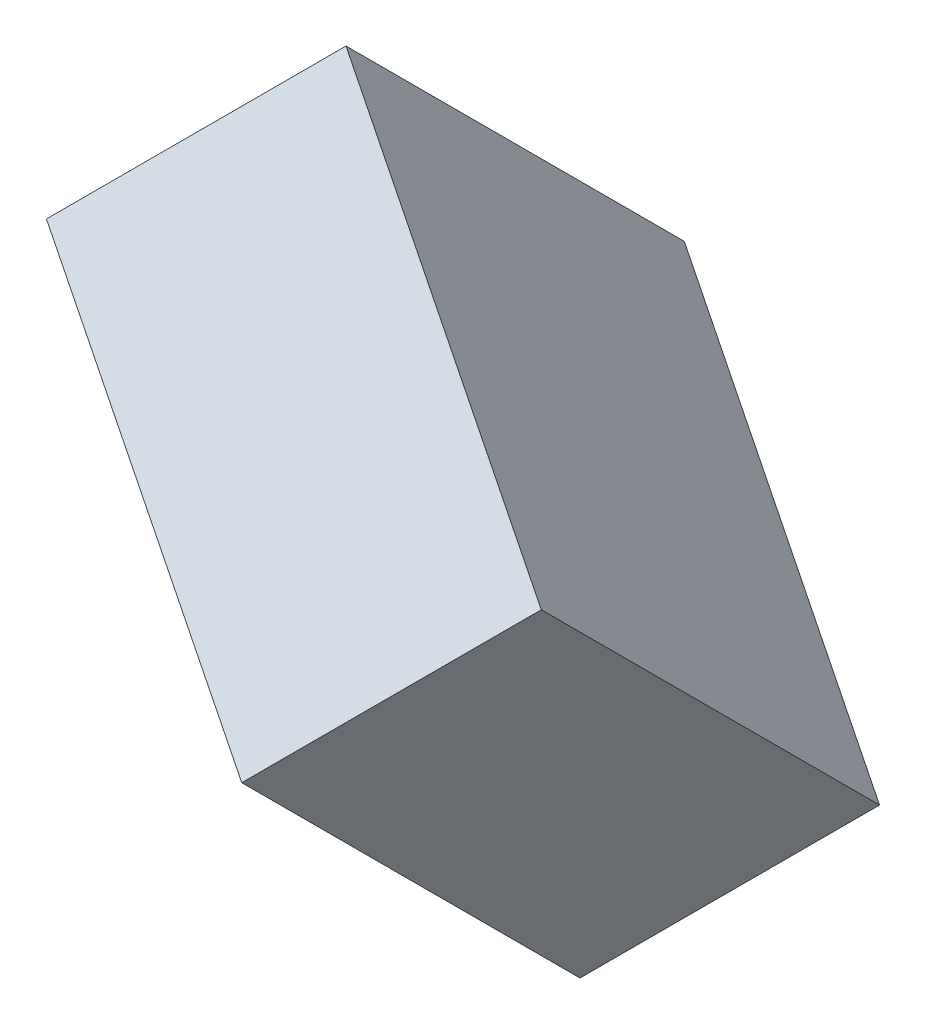
ISO-10303-21;
HEADER;
FILE_DESCRIPTION(('STEP AP214'),'2;1');
FILE_NAME('part.step','',(''),(''),'','','');
FILE_SCHEMA(('AUTOMOTIVE_DESIGN { 1 0 10303 214 1 1 1 1 }'));
ENDSEC;
DATA;
#1=APPLICATION_CONTEXT('core data for automotive mechanical design processes');
#2=APPLICATION_PROTOCOL_DEFINITION('international standard','automotive_design',2000,#1);
#3=PRODUCT_CONTEXT('',#1,'mechanical');
#4=PRODUCT('Part','Part','',(#3));
#5=PRODUCT_RELATED_PRODUCT_CATEGORY('part','',(#4));
#6=PRODUCT_DEFINITION_FORMATION('','',#4);
#7=PRODUCT_DEFINITION_CONTEXT('part definition',#1,'design');
#8=PRODUCT_DEFINITION('design','',#6,#7);
#9=PRODUCT_DEFINITION_SHAPE('','',#8);
#10=(LENGTH_UNIT() NAMED_UNIT(*) SI_UNIT(.MILLI.,.METRE.));
#11=(NAMED_UNIT(*) PLANE_ANGLE_UNIT() SI_UNIT($,.RADIAN.));
#12=(NAMED_UNIT(*) SI_UNIT($,.STERADIAN.) SOLID_ANGLE_UNIT());
#13=UNCERTAINTY_MEASURE_WITH_UNIT(LENGTH_MEASURE(1.E-05),#10,'distance_accuracy_value','');
#14=(GEOMETRIC_REPRESENTATION_CONTEXT(3) GLOBAL_UNCERTAINTY_ASSIGNED_CONTEXT((#13)) GLOBAL_UNIT_ASSIGNED_CONTEXT((#10,
#11,#12)) REPRESENTATION_CONTEXT('',''));
#15=CARTESIAN_POINT('',(0.,0.,0.));
#16=DIRECTION('',(0.,0.,1.));
#17=DIRECTION('',(1.,0.,0.));
#18=AXIS2_PLACEMENT_3D('',#15,#16,#17);
#19=CARTESIAN_POINT('',(24.9368585897261,24.9368596950449,-24.9368227024205));
#20=DIRECTION('',(-0.577350537619435,-0.577350563210324,0.577349706738708));
#21=DIRECTION('',(0.707106796857695,-0.7071067655154,0.));
#22=AXIS2_PLACEMENT_3D('',#19,#20,#21);
#23=PLANE('',#22);
#24=DIRECTION('',(0.408247883703273,0.408247901798737,0.816496978640294));
#25=VECTOR('',#24,1.);
#26=CARTESIAN_POINT('',(21.2615841130028,30.2542041789754,-23.2947500963727));
#27=LINE('',#26,#25);
#28=CARTESIAN_POINT('',(24.8615788817128,33.854199107254,-16.0947498781009));
#29=VERTEX_POINT('',#28);
#30=CARTESIAN_POINT('',(25.42825286087,34.4208731115289,-14.9614002385172));
#31=VERTEX_POINT('',#30);
#32=EDGE_CURVE('E218',#29,#31,#27,.T.);
#33=ORIENTED_EDGE('',*,*,#32,.F.);
#34=DIRECTION('',(0.,0.707106256706621,0.707107305666085));
#35=VECTOR('',#34,1.);
#36=CARTESIAN_POINT('',(24.8615788817128,24.9744996032201,-24.9744625547588));
#37=LINE('',#36,#35);
#38=CARTESIAN_POINT('',(24.8615788817128,23.0542396586723,-26.8947253479235));
#39=VERTEX_POINT('',#38);
#40=EDGE_CURVE('E379',#39,#29,#37,.T.);
#41=ORIENTED_EDGE('',*,*,#40,.F.);
#42=DIRECTION('',(0.707106796857695,-0.7071067655154,0.));
#43=VECTOR('',#42,1.);
#44=CARTESIAN_POINT('',(23.9579087192015,23.9579097811286,-26.8947253479235));
#45=LINE('',#44,#43);
#46=CARTESIAN_POINT('',(14.0616332907576,33.8541847709232,-26.8947253479235));
#47=VERTEX_POINT('',#46);
#48=EDGE_CURVE('E217',#47,#39,#45,.T.);
#49=ORIENTED_EDGE('',*,*,#48,.F.);
#50=DIRECTION('',(0.816496391119121,-0.408248783080944,0.408248177463634));
#51=VECTOR('',#50,1.);
#52=CARTESIAN_POINT('',(15.9282532593184,32.9208734434903,-25.9614154050128));
#53=LINE('',#52,#51);
#54=CARTESIAN_POINT('',(12.9282546522816,34.4208749029407,-27.4614146448014));
#55=VERTEX_POINT('',#54);
#56=EDGE_CURVE('E194',#55,#47,#53,.T.);
#57=ORIENTED_EDGE('',*,*,#56,.F.);
#58=CARTESIAN_POINT('',(11.5949210394075,37.0875412309669,-26.1280798926121));
#59=DIRECTION('',(-0.577350537619435,-0.577350563210324,0.577349706738708));
#60=DIRECTION('',(-0.707106526552883,0.707107035819914,5.40610115312701E-07));
#61=AXIS2_PLACEMENT_3D('',#58,#59,#60);
#62=ELLIPSE('',#61,4.,2.30940059257966);
#63=CARTESIAN_POINT('',(8.92825561256531,38.4208758632244,-27.4614125469322));
#64=VERTEX_POINT('',#63);
#65=EDGE_CURVE('E205',#64,#55,#62,.T.);
#66=ORIENTED_EDGE('',*,*,#65,.F.);
#67=DIRECTION('',(0.408248323946754,-0.816496373023439,-0.408248672789314));
#68=VECTOR('',#67,1.);
#69=CARTESIAN_POINT('',(4.76158807233364,46.7542081383065,-23.2947414463406));
#70=LINE('',#69,#68);
#71=CARTESIAN_POINT('',(8.36156889778253,39.5542489112447,-26.8947253479234));
#72=VERTEX_POINT('',#71);
#73=EDGE_CURVE('E202',#72,#64,#70,.T.);
#74=ORIENTED_EDGE('',*,*,#73,.F.);
#75=DIRECTION('',(0.707106796857694,-0.7071067655154,0.));
#76=VECTOR('',#75,1.);
#77=CARTESIAN_POINT('',(23.9579087192015,23.9579097811286,-26.8947253479235));
#78=LINE('',#77,#76);
#79=CARTESIAN_POINT('',(-2.43838183012104,50.3541991604437,-26.8947253479234));
#80=VERTEX_POINT('',#79);
#81=EDGE_CURVE('E715',#80,#72,#78,.T.);
#82=ORIENTED_EDGE('',*,*,#81,.F.);
#83=DIRECTION('',(-0.707106272377781,0.,-0.707107289994948));
#84=VECTOR('',#83,1.);
#85=CARTESIAN_POINT('',(12.2281700043155,50.3541991604437,-12.2281524064263));
#86=LINE('',#85,#84);
#87=CARTESIAN_POINT('',(8.36158124552423,50.3541991604437,-16.0947467297377));
#88=VERTEX_POINT('',#87);
#89=EDGE_CURVE('E705',#88,#80,#86,.T.);
#90=ORIENTED_EDGE('',*,*,#89,.F.);
#91=DIRECTION('',(-0.408247051382313,-0.408248734119096,-0.816496978639727));
#92=VECTOR('',#91,1.);
#93=CARTESIAN_POINT('',(8.92825261708387,50.9208728677428,-14.9613999947315));
#94=LINE('',#93,#92);
#95=CARTESIAN_POINT('',(8.92825261708386,50.9208728677428,-14.9613999947315));
#96=VERTEX_POINT('',#95);
#97=EDGE_CURVE('E234',#96,#88,#94,.T.);
#98=ORIENTED_EDGE('',*,*,#97,.F.);
#99=CARTESIAN_POINT('',(11.5949180439261,49.5875382354854,-13.6280673404114));
#100=DIRECTION('',(-0.577350537619435,-0.577350563210324,0.577349706738708));
#101=DIRECTION('',(0.70710627237778,0.,0.707107289994949));
#102=AXIS2_PLACEMENT_3D('',#99,#100,#101);
#103=ELLIPSE('',#102,4.,2.30940225284129);
#104=CARTESIAN_POINT('',(12.9282506982461,50.920870948905,-10.9613980758965));
#105=VERTEX_POINT('',#104);
#106=EDGE_CURVE('E231',#105,#96,#103,.T.);
#107=ORIENTED_EDGE('',*,*,#106,.F.);
#108=DIRECTION('',(-0.816496391119122,0.408248783080944,-0.408248177463634));
#109=VECTOR('',#108,1.);
#110=CARTESIAN_POINT('',(21.261580157128,46.7542002231004,-6.79473353114629));
#111=LINE('',#110,#109);
#112=CARTESIAN_POINT('',(14.0615926441446,50.3541991604437,-10.3947271280654));
#113=VERTEX_POINT('',#112);
#114=EDGE_CURVE('E228',#113,#105,#111,.T.);
#115=ORIENTED_EDGE('',*,*,#114,.F.);
#116=DIRECTION('',(-0.707106272377781,0.,-0.707107289994948));
#117=VECTOR('',#116,1.);
#118=CARTESIAN_POINT('',(12.2281700043155,50.3541991604437,-12.2281524064262));
#119=LINE('',#118,#117);
#120=CARTESIAN_POINT('',(24.8615788817128,50.3541991604437,0.40527465207656));
#121=VERTEX_POINT('',#120);
#122=EDGE_CURVE('E717',#121,#113,#119,.T.);
#123=ORIENTED_EDGE('',*,*,#122,.F.);
#124=DIRECTION('',(0.,0.707106256706622,0.707107305666085));
#125=VECTOR('',#124,1.);
#126=CARTESIAN_POINT('',(24.8615788817128,24.9744996032201,-24.9744625547588));
#127=LINE('',#126,#125);
#128=CARTESIAN_POINT('',(24.8615788817128,39.5542134547712,-10.3947270748758));
#129=VERTEX_POINT('',#128);
#130=EDGE_CURVE('E51',#129,#121,#127,.T.);
#131=ORIENTED_EDGE('',*,*,#130,.F.);
#132=DIRECTION('',(-0.408248792128709,0.816496373023617,0.408248204606864));
#133=VECTOR('',#132,1.);
#134=CARTESIAN_POINT('',(25.4282508829326,38.4208711335914,-10.9613982605827));
#135=LINE('',#134,#133);
#136=CARTESIAN_POINT('',(25.4282508829326,38.4208711335914,-10.9613982605827));
#137=VERTEX_POINT('',#136);
#138=EDGE_CURVE('E59',#137,#129,#135,.T.);
#139=ORIENTED_EDGE('',*,*,#138,.F.);
#140=CARTESIAN_POINT('',(24.0949182286125,37.0875384201718,-13.6280675250976));
#141=DIRECTION('',(-0.577350537619435,-0.577350563210324,0.577349706738708));
#142=DIRECTION('',(0.,-0.707106256706622,-0.707107305666084));
#143=AXIS2_PLACEMENT_3D('',#140,#141,#142);
#144=ELLIPSE('',#143,4.,2.30940215047774);
#145=EDGE_CURVE('E221',#31,#137,#144,.T.);
#146=ORIENTED_EDGE('',*,*,#145,.F.);
#147=EDGE_LOOP('',(#33,#41,#49,#57,#66,#74,#82,#90,#98,#107,#115,#123,#131,#139,#146));
#148=FACE_BOUND('',#147,.T.);
#149=DIRECTION('',(0.,0.707106256706622,0.707107305666085));
#150=VECTOR('',#149,1.);
#151=CARTESIAN_POINT('',(38.2152295107166,10.5819349829693,-26.0133786790841));
#152=LINE('',#151,#150);
#153=CARTESIAN_POINT('',(38.2152295107166,10.5819349829693,-26.0133786790841));
#154=VERTEX_POINT('',#153);
#155=CARTESIAN_POINT('',(38.2152295107166,49.4727791018334,12.8775231325506));
#156=VERTEX_POINT('',#155);
#157=EDGE_CURVE('E238',#154,#156,#152,.T.);
#158=ORIENTED_EDGE('',*,*,#157,.T.);
#159=DIRECTION('',(-0.816496391119122,0.408248783080944,-0.408248177463634));
#160=VECTOR('',#159,1.);
#161=CARTESIAN_POINT('',(38.2152295107166,49.4727791018334,12.8775231325506));
#162=LINE('',#161,#160);
#163=CARTESIAN_POINT('',(-6.69207200083505,71.9264621712853,-9.57612662794926));
#164=VERTEX_POINT('',#163);
#165=EDGE_CURVE('E750',#156,#164,#162,.T.);
#166=ORIENTED_EDGE('',*,*,#165,.T.);
#167=DIRECTION('',(0.,-0.707106256706621,-0.707107305666085));
#168=VECTOR('',#167,1.);
#169=CARTESIAN_POINT('',(-6.69207200083506,33.0356180524212,-48.4670284395839));
#170=LINE('',#169,#168);
#171=CARTESIAN_POINT('',(-6.69207200083506,33.0356180524212,-48.4670284395839));
#172=VERTEX_POINT('',#171);
#173=EDGE_CURVE('E748',#164,#172,#170,.T.);
#174=ORIENTED_EDGE('',*,*,#173,.T.);
#175=DIRECTION('',(0.816496391119122,-0.408248783080944,0.408248177463634));
#176=VECTOR('',#175,1.);
#177=CARTESIAN_POINT('',(38.2152295107166,10.5819349829693,-26.0133786790841));
#178=LINE('',#177,#176);
#179=EDGE_CURVE('E746',#172,#154,#178,.T.);
#180=ORIENTED_EDGE('',*,*,#179,.T.);
#181=EDGE_LOOP('',(#158,#166,#174,#180));
#182=FACE_BOUND('',#181,.T.);
#183=ADVANCED_FACE('F43',(#148,#182),#23,.T.);
#184=CARTESIAN_POINT('',(38.2152295107166,10.5819349829693,-26.0133786790841));
#185=DIRECTION('',(-0.816496391119122,0.408248783080944,-0.408248177463634));
#186=DIRECTION('',(-0.447214110377798,-0.89442693356081,0.));
#187=AXIS2_PLACEMENT_3D('',#184,#185,#186);
#188=PLANE('',#187);
#189=DIRECTION('',(0.,0.707106256706622,0.707107305666085));
#190=VECTOR('',#189,1.);
#191=CARTESIAN_POINT('',(55.4354188562685,27.8021250918008,-43.2335432425971));
#192=LINE('',#191,#190);
#193=CARTESIAN_POINT('',(55.4354188562685,27.8021250918008,-43.2335432425971));
#194=VERTEX_POINT('',#193);
#195=CARTESIAN_POINT('',(55.4354188562685,66.692969210665,-4.34264143096244));
#196=VERTEX_POINT('',#195);
#197=EDGE_CURVE('E740',#194,#196,#192,.T.);
#198=ORIENTED_EDGE('',*,*,#197,.T.);
#199=DIRECTION('',(0.577350537619435,0.577350563210324,-0.577349706738708));
#200=VECTOR('',#199,1.);
#201=CARTESIAN_POINT('',(38.2152295107166,49.4727791018334,12.8775231325506));
#202=LINE('',#201,#200);
#203=EDGE_CURVE('E726',#156,#196,#202,.T.);
#204=ORIENTED_EDGE('',*,*,#203,.F.);
#205=ORIENTED_EDGE('',*,*,#157,.F.);
#206=DIRECTION('',(0.577350537619435,0.577350563210324,-0.577349706738708));
#207=VECTOR('',#206,1.);
#208=CARTESIAN_POINT('',(38.2152295107166,10.5819349829693,-26.0133786790841));
#209=LINE('',#208,#207);
#210=EDGE_CURVE('E737',#154,#194,#209,.T.);
#211=ORIENTED_EDGE('',*,*,#210,.T.);
#212=EDGE_LOOP('',(#198,#204,#205,#211));
#213=FACE_BOUND('',#212,.T.);
#214=ADVANCED_FACE('F301',(#213),#188,.F.);
#215=CARTESIAN_POINT('',(38.2152295107166,49.4727791018334,12.8775231325506));
#216=DIRECTION('',(0.,-0.707106256706621,-0.707107305666085));
#217=DIRECTION('',(0.,0.707107305666085,-0.707106256706621));
#218=AXIS2_PLACEMENT_3D('',#215,#216,#217);
#219=PLANE('',#218);
#220=DIRECTION('',(-0.816496391119122,0.408248783080944,-0.408248177463634));
#221=VECTOR('',#220,1.);
#222=CARTESIAN_POINT('',(55.4354188562685,66.692969210665,-4.34264143096244));
#223=LINE('',#222,#221);
#224=CARTESIAN_POINT('',(10.5281173447168,89.1466522801169,-26.7962911914623));
#225=VERTEX_POINT('',#224);
#226=EDGE_CURVE('E730',#196,#225,#223,.T.);
#227=ORIENTED_EDGE('',*,*,#226,.T.);
#228=DIRECTION('',(0.577350537619435,0.577350563210324,-0.577349706738708));
#229=VECTOR('',#228,1.);
#230=CARTESIAN_POINT('',(-6.69207200083505,71.9264621712853,-9.57612662794926));
#231=LINE('',#230,#229);
#232=EDGE_CURVE('E731',#164,#225,#231,.T.);
#233=ORIENTED_EDGE('',*,*,#232,.F.);
#234=ORIENTED_EDGE('',*,*,#165,.F.);
#235=ORIENTED_EDGE('',*,*,#203,.T.);
#236=EDGE_LOOP('',(#227,#233,#234,#235));
#237=FACE_BOUND('',#236,.T.);
#238=ADVANCED_FACE('F304',(#237),#219,.F.);
#239=CARTESIAN_POINT('',(-6.69207200083506,33.0356180524212,-48.4670284395839));
#240=DIRECTION('',(0.816496391119122,-0.408248783080944,0.408248177463634));
#241=DIRECTION('',(0.447214110377799,0.89442693356081,0.));
#242=AXIS2_PLACEMENT_3D('',#239,#240,#241);
#243=PLANE('',#242);
#244=DIRECTION('',(0.,-0.707106256706621,-0.707107305666085));
#245=VECTOR('',#244,1.);
#246=CARTESIAN_POINT('',(10.5281173447168,50.2558081612528,-65.687193003097));
#247=LINE('',#246,#245);
#248=CARTESIAN_POINT('',(10.5281173447168,50.2558081612528,-65.687193003097));
#249=VERTEX_POINT('',#248);
#250=EDGE_CURVE('E729',#225,#249,#247,.T.);
#251=ORIENTED_EDGE('',*,*,#250,.T.);
#252=DIRECTION('',(0.577350537619435,0.577350563210324,-0.577349706738708));
#253=VECTOR('',#252,1.);
#254=CARTESIAN_POINT('',(-6.69207200083506,33.0356180524212,-48.4670284395839));
#255=LINE('',#254,#253);
#256=EDGE_CURVE('E701',#172,#249,#255,.T.);
#257=ORIENTED_EDGE('',*,*,#256,.F.);
#258=ORIENTED_EDGE('',*,*,#173,.F.);
#259=ORIENTED_EDGE('',*,*,#232,.T.);
#260=EDGE_LOOP('',(#251,#257,#258,#259));
#261=FACE_BOUND('',#260,.T.);
#262=ADVANCED_FACE('F308',(#261),#243,.F.);
#263=CARTESIAN_POINT('',(38.2152295107166,10.5819349829693,-26.0133786790841));
#264=DIRECTION('',(0.,0.707106256706621,0.707107305666085));
#265=DIRECTION('',(0.,-0.707107305666085,0.707106256706621));
#266=AXIS2_PLACEMENT_3D('',#263,#264,#265);
#267=PLANE('',#266);
#268=DIRECTION('',(0.816496391119122,-0.408248783080944,0.408248177463634));
#269=VECTOR('',#268,1.);
#270=CARTESIAN_POINT('',(55.4354188562685,27.8021250918008,-43.2335432425971));
#271=LINE('',#270,#269);
#272=EDGE_CURVE('E734',#249,#194,#271,.T.);
#273=ORIENTED_EDGE('',*,*,#272,.T.);
#274=ORIENTED_EDGE('',*,*,#210,.F.);
#275=ORIENTED_EDGE('',*,*,#179,.F.);
#276=ORIENTED_EDGE('',*,*,#256,.T.);
#277=EDGE_LOOP('',(#273,#274,#275,#276));
#278=FACE_BOUND('',#277,.T.);
#279=ADVANCED_FACE('F312',(#278),#267,.F.);
#280=CARTESIAN_POINT('',(42.157047935278,42.1570498038765,-42.1569872659335));
#281=DIRECTION('',(-0.577350537619435,-0.577350563210324,0.577349706738708));
#282=DIRECTION('',(0.707106796857695,-0.7071067655154,0.));
#283=AXIS2_PLACEMENT_3D('',#280,#281,#282);
#284=PLANE('',#283);
#285=ORIENTED_EDGE('',*,*,#197,.F.);
#286=ORIENTED_EDGE('',*,*,#272,.F.);
#287=ORIENTED_EDGE('',*,*,#250,.F.);
#288=ORIENTED_EDGE('',*,*,#226,.F.);
#289=EDGE_LOOP('',(#285,#286,#287,#288));
#290=FACE_BOUND('',#289,.T.);
#291=ADVANCED_FACE('F316',(#290),#284,.F.);
#292=CARTESIAN_POINT('',(24.8615788817128,23.0541991604437,-26.8947253479235));
#293=DIRECTION('',(0.,0.,-1.));
#294=DIRECTION('',(0.,1.,0.));
#295=AXIS2_PLACEMENT_3D('',#292,#293,#294);
#296=PLANE('',#295);
#297=DIRECTION('',(0.,1.,0.));
#298=VECTOR('',#297,1.);
#299=CARTESIAN_POINT('',(24.8615788817128,23.0541991604437,-26.8947253479235));
#300=LINE('',#299,#298);
#301=CARTESIAN_POINT('',(24.8615717135477,33.8541919390886,-26.8947253479235));
#302=VERTEX_POINT('',#301);
#303=EDGE_CURVE('E375',#39,#302,#300,.T.);
#304=ORIENTED_EDGE('',*,*,#303,.T.);
#305=DIRECTION('',(1.,0.,0.));
#306=VECTOR('',#305,1.);
#307=CARTESIAN_POINT('',(61.0821843638305,33.8541847709232,-26.8947253479235));
#308=LINE('',#307,#306);
#309=EDGE_CURVE('E211',#47,#302,#308,.T.);
#310=ORIENTED_EDGE('',*,*,#309,.F.);
#311=ORIENTED_EDGE('',*,*,#48,.T.);
#312=EDGE_LOOP('',(#304,#310,#311));
#313=FACE_BOUND('',#312,.T.);
#314=ADVANCED_FACE('F320',(#313),#296,.F.);
#315=CARTESIAN_POINT('',(24.8615788817128,23.0541991604437,-21.2947253479234));
#316=DIRECTION('',(1.,0.,0.));
#317=DIRECTION('',(0.,0.,-1.));
#318=AXIS2_PLACEMENT_3D('',#315,#316,#317);
#319=PLANE('',#318);
#320=ORIENTED_EDGE('',*,*,#40,.T.);
#321=DIRECTION('',(0.,0.,1.));
#322=VECTOR('',#321,1.);
#323=CARTESIAN_POINT('',(24.8615788817127,33.854199107254,-68.4486162186449));
#324=LINE('',#323,#322);
#325=EDGE_CURVE('E395',#302,#29,#324,.T.);
#326=ORIENTED_EDGE('',*,*,#325,.F.);
#327=ORIENTED_EDGE('',*,*,#303,.F.);
#328=EDGE_LOOP('',(#320,#326,#327));
#329=FACE_BOUND('',#328,.T.);
#330=ADVANCED_FACE('F322',(#329),#319,.F.);
#331=CARTESIAN_POINT('',(-2.43842111828726,50.3541991604437,-26.8947253479234));
#332=DIRECTION('',(0.,1.,0.));
#333=DIRECTION('',(-1.,0.,0.));
#334=AXIS2_PLACEMENT_3D('',#331,#332,#333);
#335=PLANE('',#334);
#336=DIRECTION('',(-7.64538435111946E-07,0.,-0.999999999999708));
#337=VECTOR('',#336,1.);
#338=CARTESIAN_POINT('',(8.36155124292704,50.3541991604436,-63.1152413475106));
#339=LINE('',#338,#337);
#340=CARTESIAN_POINT('',(8.36158505120043,50.3541991604437,-18.894739360653));
#341=VERTEX_POINT('',#340);
#342=CARTESIAN_POINT('',(8.36157715475784,50.3541973802991,-26.8947253479234));
#343=VERTEX_POINT('',#342);
#344=EDGE_CURVE('E392',#341,#343,#339,.T.);
#345=ORIENTED_EDGE('',*,*,#344,.F.);
#346=DIRECTION('',(1.35917365163838E-06,0.,-0.999999999999076));
#347=VECTOR('',#346,1.);
#348=CARTESIAN_POINT('',(8.36164107713876,50.3541991604436,-60.1153282591606));
#349=LINE('',#348,#347);
#350=EDGE_CURVE('E385',#88,#341,#349,.T.);
#351=ORIENTED_EDGE('',*,*,#350,.F.);
#352=ORIENTED_EDGE('',*,*,#89,.T.);
#353=DIRECTION('',(1.,0.,0.));
#354=VECTOR('',#353,1.);
#355=CARTESIAN_POINT('',(-2.43842111828726,50.3541991604437,-26.8947253479234));
#356=LINE('',#355,#354);
#357=EDGE_CURVE('E380',#80,#343,#356,.T.);
#358=ORIENTED_EDGE('',*,*,#357,.T.);
#359=EDGE_LOOP('',(#345,#351,#352,#358));
#360=FACE_BOUND('',#359,.T.);
#361=ADVANCED_FACE('F325',(#360),#335,.F.);
#362=CARTESIAN_POINT('',(-2.43842111828727,44.7541991604437,-26.8947253479234));
#363=DIRECTION('',(0.,0.,-1.));
#364=DIRECTION('',(0.,1.,0.));
#365=AXIS2_PLACEMENT_3D('',#362,#363,#364);
#366=PLANE('',#365);
#367=ORIENTED_EDGE('',*,*,#81,.T.);
#368=DIRECTION('',(-7.64538397627278E-07,-0.999999999999708,0.));
#369=VECTOR('',#368,1.);
#370=CARTESIAN_POINT('',(8.3616089243678,91.9081730138129,-26.8947253479234));
#371=LINE('',#370,#369);
#372=EDGE_CURVE('E383',#343,#72,#371,.T.);
#373=ORIENTED_EDGE('',*,*,#372,.F.);
#374=ORIENTED_EDGE('',*,*,#357,.F.);
#375=EDGE_LOOP('',(#367,#373,#374));
#376=FACE_BOUND('',#375,.T.);
#377=ADVANCED_FACE('F465',(#376),#366,.F.);
#378=CARTESIAN_POINT('',(19.2615788817127,50.3541991604437,0.40527465207656));
#379=DIRECTION('',(0.,1.,0.));
#380=DIRECTION('',(-1.,0.,0.));
#381=AXIS2_PLACEMENT_3D('',#378,#379,#380);
#382=PLANE('',#381);
#383=ORIENTED_EDGE('',*,*,#122,.T.);
#384=DIRECTION('',(-1.,0.,0.));
#385=VECTOR('',#384,1.);
#386=CARTESIAN_POINT('',(66.41551126164,50.3541991604437,-10.3947271280653));
#387=LINE('',#386,#385);
#388=CARTESIAN_POINT('',(24.8615788817128,50.354199107254,-10.3947270748758));
#389=VERTEX_POINT('',#388);
#390=EDGE_CURVE('E386',#389,#113,#387,.T.);
#391=ORIENTED_EDGE('',*,*,#390,.F.);
#392=DIRECTION('',(0.,0.,-1.));
#393=VECTOR('',#392,1.);
#394=CARTESIAN_POINT('',(24.8615788817128,50.3541991604437,0.40527465207656));
#395=LINE('',#394,#393);
#396=EDGE_CURVE('E11',#121,#389,#395,.T.);
#397=ORIENTED_EDGE('',*,*,#396,.F.);
#398=EDGE_LOOP('',(#383,#391,#397));
#399=FACE_BOUND('',#398,.T.);
#400=ADVANCED_FACE('F463',(#399),#382,.F.);
#401=CARTESIAN_POINT('',(24.8615788817128,50.3541991604437,0.40527465207656));
#402=DIRECTION('',(1.,0.,0.));
#403=DIRECTION('',(0.,0.,-1.));
#404=AXIS2_PLACEMENT_3D('',#401,#402,#403);
#405=PLANE('',#404);
#406=ORIENTED_EDGE('',*,*,#396,.T.);
#407=DIRECTION('',(0.,1.,0.));
#408=VECTOR('',#407,1.);
#409=CARTESIAN_POINT('',(24.8615788817128,83.5748042395379,-10.3947270748758));
#410=LINE('',#409,#408);
#411=EDGE_CURVE('E770',#129,#389,#410,.T.);
#412=ORIENTED_EDGE('',*,*,#411,.F.);
#413=ORIENTED_EDGE('',*,*,#130,.T.);
#414=EDGE_LOOP('',(#406,#412,#413));
#415=FACE_BOUND('',#414,.T.);
#416=ADVANCED_FACE('F296',(#415),#405,.F.);
#417=CARTESIAN_POINT('',(61.0821843638305,78.0748065494368,-71.1152815272851));
#418=DIRECTION('',(0.,-0.707106256706622,-0.707107305666084));
#419=DIRECTION('',(0.,0.707107305666084,-0.707106256706622));
#420=AXIS2_PLACEMENT_3D('',#417,#418,#419);
#421=PLANE('',#420);
#422=ORIENTED_EDGE('',*,*,#309,.T.);
#423=DIRECTION('',(-0.577350537619435,-0.577350563210324,0.577349706738708));
#424=VECTOR('',#423,1.);
#425=CARTESIAN_POINT('',(66.4155152175149,75.4081372849219,-68.4486162186449));
#426=LINE('',#425,#424);
#427=CARTESIAN_POINT('',(26.0615788817128,35.0541991604437,-28.0947379572807));
#428=VERTEX_POINT('',#427);
#429=EDGE_CURVE('E201',#428,#302,#426,.T.);
#430=ORIENTED_EDGE('',*,*,#429,.F.);
#431=DIRECTION('',(-1.,0.,0.));
#432=VECTOR('',#431,1.);
#433=CARTESIAN_POINT('',(26.0615788817128,35.0541991604437,-28.0947379572807));
#434=LINE('',#433,#432);
#435=CARTESIAN_POINT('',(18.0615788817128,35.0541991604437,-28.0947379572807));
#436=VERTEX_POINT('',#435);
#437=EDGE_CURVE('E372',#428,#436,#434,.T.);
#438=ORIENTED_EDGE('',*,*,#437,.T.);
#439=DIRECTION('',(-1.,0.,0.));
#440=VECTOR('',#439,1.);
#441=CARTESIAN_POINT('',(26.0615788817128,35.0541991604437,-28.0947379627985));
#442=LINE('',#441,#440);
#443=CARTESIAN_POINT('',(13.5615788817127,35.0541991604437,-28.0947379627985));
#444=VERTEX_POINT('',#443);
#445=EDGE_CURVE('E197',#436,#444,#442,.T.);
#446=ORIENTED_EDGE('',*,*,#445,.T.);
#447=DIRECTION('',(-0.577350537619435,-0.577350563210324,0.577349706738708));
#448=VECTOR('',#447,1.);
#449=CARTESIAN_POINT('',(58.0821857567938,79.5748080088872,-72.6152807670737));
#450=LINE('',#449,#448);
#451=EDGE_CURVE('E189',#444,#55,#450,.T.);
#452=ORIENTED_EDGE('',*,*,#451,.T.);
#453=ORIENTED_EDGE('',*,*,#56,.T.);
#454=EDGE_LOOP('',(#422,#430,#438,#446,#452,#453));
#455=FACE_BOUND('',#454,.T.);
#456=ADVANCED_FACE('F192',(#455),#421,.F.);
#457=CARTESIAN_POINT('',(66.4155152175149,75.4081372849219,-68.4486162186449));
#458=DIRECTION('',(0.707106796857695,-0.7071067655154,0.));
#459=DIRECTION('',(0.7071067655154,0.707106796857695,0.));
#460=AXIS2_PLACEMENT_3D('',#457,#458,#459);
#461=PLANE('',#460);
#462=ORIENTED_EDGE('',*,*,#325,.T.);
#463=ORIENTED_EDGE('',*,*,#32,.T.);
#464=DIRECTION('',(-0.577350537619435,-0.577350563210324,0.577349706738708));
#465=VECTOR('',#464,1.);
#466=CARTESIAN_POINT('',(70.5821839653821,79.5748062174754,-60.1152663607895));
#467=LINE('',#466,#465);
#468=CARTESIAN_POINT('',(26.0615788817128,35.0541991604437,-15.5947253479234));
#469=VERTEX_POINT('',#468);
#470=EDGE_CURVE('E776',#469,#31,#467,.T.);
#471=ORIENTED_EDGE('',*,*,#470,.F.);
#472=DIRECTION('',(0.,0.,-1.));
#473=VECTOR('',#472,1.);
#474=CARTESIAN_POINT('',(26.0615788817128,35.0541991604437,-28.0947379572807));
#475=LINE('',#474,#473);
#476=EDGE_CURVE('E422',#469,#428,#475,.T.);
#477=ORIENTED_EDGE('',*,*,#476,.T.);
#478=ORIENTED_EDGE('',*,*,#429,.T.);
#479=EDGE_LOOP('',(#462,#463,#471,#477,#478));
#480=FACE_BOUND('',#479,.T.);
#481=ADVANCED_FACE('F289',(#480),#461,.F.);
#482=CARTESIAN_POINT('',(69.2488493331246,82.2414715261183,-58.7819336473698));
#483=DIRECTION('',(-0.577350537619435,-0.577350563210324,0.577349706738708));
#484=DIRECTION('',(0.,-0.707106256706622,-0.707107305666084));
#485=AXIS2_PLACEMENT_3D('',#482,#483,#484);
#486=ELLIPSE('',#485,4.,2.30940215047774);
#487=DIRECTION('',(-0.577350537619435,-0.577350563210324,0.577349706738708));
#488=VECTOR('',#487,1.);
#489=SURFACE_OF_LINEAR_EXTRUSION('',#486,#488);
#490=CARTESIAN_POINT('',(26.0615788817128,39.0541991604437,-15.5947253479234));
#491=DIRECTION('',(-1.,0.,0.));
#492=DIRECTION('',(0.,0.,1.));
#493=AXIS2_PLACEMENT_3D('',#490,#491,#492);
#494=CIRCLE('',#493,4.);
#495=CARTESIAN_POINT('',(26.0615788817128,39.0541991604437,-11.5947253479234));
#496=VERTEX_POINT('',#495);
#497=EDGE_CURVE('E418',#496,#469,#494,.F.);
#498=ORIENTED_EDGE('',*,*,#497,.T.);
#499=ORIENTED_EDGE('',*,*,#470,.T.);
#500=ORIENTED_EDGE('',*,*,#145,.T.);
#501=DIRECTION('',(-0.577350537619435,-0.577350563210324,0.577349706738708));
#502=VECTOR('',#501,1.);
#503=CARTESIAN_POINT('',(70.5821819874447,83.5748042395379,-56.1152643828549));
#504=LINE('',#503,#502);
#505=EDGE_CURVE('E773',#496,#137,#504,.T.);
#506=ORIENTED_EDGE('',*,*,#505,.F.);
#507=EDGE_LOOP('',(#498,#499,#500,#506));
#508=FACE_BOUND('',#507,.T.);
#509=ADVANCED_FACE('F285',(#508),#489,.F.);
#510=CARTESIAN_POINT('',(70.5821819874447,83.5748042395379,-56.1152643828549));
#511=DIRECTION('',(0.70710627237778,0.,0.707107289994949));
#512=DIRECTION('',(0.707107289994949,0.,-0.70710627237778));
#513=AXIS2_PLACEMENT_3D('',#510,#511,#512);
#514=PLANE('',#513);
#515=DIRECTION('',(0.,-1.,0.));
#516=VECTOR('',#515,1.);
#517=CARTESIAN_POINT('',(26.0615788817128,51.5541991604437,-11.5947253479234));
#518=LINE('',#517,#516);
#519=CARTESIAN_POINT('',(26.0615788817128,51.5541991604437,-11.5947253479235));
#520=VERTEX_POINT('',#519);
#521=EDGE_CURVE('E785',#520,#496,#518,.T.);
#522=ORIENTED_EDGE('',*,*,#521,.T.);
#523=ORIENTED_EDGE('',*,*,#505,.T.);
#524=ORIENTED_EDGE('',*,*,#138,.T.);
#525=ORIENTED_EDGE('',*,*,#411,.T.);
#526=DIRECTION('',(-0.577350537619435,-0.577350563210324,0.577349706738708));
#527=VECTOR('',#526,1.);
#528=CARTESIAN_POINT('',(66.4155112616401,91.908133329047,-51.9485996534186));
#529=LINE('',#528,#527);
#530=EDGE_CURVE('E769',#520,#389,#529,.T.);
#531=ORIENTED_EDGE('',*,*,#530,.F.);
#532=EDGE_LOOP('',(#522,#523,#524,#525,#531));
#533=FACE_BOUND('',#532,.T.);
#534=ADVANCED_FACE('F288',(#533),#514,.F.);
#535=CARTESIAN_POINT('',(66.4155112616401,91.908133329047,-51.9485996534186));
#536=DIRECTION('',(0.,0.707106256706622,0.707107305666084));
#537=DIRECTION('',(0.,-0.707107305666084,0.707106256706622));
#538=AXIS2_PLACEMENT_3D('',#535,#536,#537);
#539=PLANE('',#538);
#540=DIRECTION('',(1.,0.,0.));
#541=VECTOR('',#540,1.);
#542=CARTESIAN_POINT('',(26.0615788817128,51.5541991604437,-11.5947253479234));
#543=LINE('',#542,#541);
#544=CARTESIAN_POINT('',(13.5615788817127,51.5541991604437,-11.5947253479234));
#545=VERTEX_POINT('',#544);
#546=EDGE_CURVE('E442',#545,#520,#543,.T.);
#547=ORIENTED_EDGE('',*,*,#546,.T.);
#548=ORIENTED_EDGE('',*,*,#530,.T.);
#549=ORIENTED_EDGE('',*,*,#390,.T.);
#550=ORIENTED_EDGE('',*,*,#114,.T.);
#551=DIRECTION('',(-0.577350537619435,-0.577350563210324,0.577349706738708));
#552=VECTOR('',#551,1.);
#553=CARTESIAN_POINT('',(58.0821818027582,96.0748040548515,-56.1152641981688));
#554=LINE('',#553,#552);
#555=EDGE_CURVE('E768',#545,#105,#554,.T.);
#556=ORIENTED_EDGE('',*,*,#555,.F.);
#557=EDGE_LOOP('',(#547,#548,#549,#550,#556));
#558=FACE_BOUND('',#557,.T.);
#559=ADVANCED_FACE('F275',(#558),#539,.F.);
#560=CARTESIAN_POINT('',(56.7488491484382,94.7414713414319,-58.7819334626837));
#561=DIRECTION('',(-0.577350537619435,-0.577350563210324,0.577349706738708));
#562=DIRECTION('',(0.70710627237778,0.,0.707107289994949));
#563=AXIS2_PLACEMENT_3D('',#560,#561,#562);
#564=ELLIPSE('',#563,4.,2.30940225284129);
#565=DIRECTION('',(-0.577350537619435,-0.577350563210324,0.577349706738708));
#566=VECTOR('',#565,1.);
#567=SURFACE_OF_LINEAR_EXTRUSION('',#564,#566);
#568=CARTESIAN_POINT('',(13.5615788817127,51.5541991604437,-15.5947253479234));
#569=DIRECTION('',(0.,-1.,0.));
#570=DIRECTION('',(0.,0.,-1.));
#571=AXIS2_PLACEMENT_3D('',#568,#569,#570);
#572=CIRCLE('',#571,4.);
#573=CARTESIAN_POINT('',(9.56157888171273,51.5541991604437,-15.5947253479234));
#574=VERTEX_POINT('',#573);
#575=EDGE_CURVE('E409',#574,#545,#572,.F.);
#576=ORIENTED_EDGE('',*,*,#575,.T.);
#577=ORIENTED_EDGE('',*,*,#555,.T.);
#578=ORIENTED_EDGE('',*,*,#106,.T.);
#579=DIRECTION('',(-0.577350537619435,-0.577350563210324,0.577349706738708));
#580=VECTOR('',#579,1.);
#581=CARTESIAN_POINT('',(54.082183721596,96.0748059736893,-60.1152661170038));
#582=LINE('',#581,#580);
#583=EDGE_CURVE('E247',#574,#96,#582,.T.);
#584=ORIENTED_EDGE('',*,*,#583,.F.);
#585=EDGE_LOOP('',(#576,#577,#578,#584));
#586=FACE_BOUND('',#585,.T.);
#587=ADVANCED_FACE('F271',(#586),#567,.F.);
#588=CARTESIAN_POINT('',(54.082183721596,96.0748059736893,-60.1152661170038));
#589=DIRECTION('',(-0.707107277397282,0.707106284974811,-9.6108158119719E-07));
#590=DIRECTION('',(-0.707106284975138,-0.707107277397609,0.));
#591=AXIS2_PLACEMENT_3D('',#588,#589,#590);
#592=PLANE('',#591);
#593=CARTESIAN_POINT('',(9.56157888171274,51.5541930441412,-20.0947345223623));
#594=DIRECTION('',(0.,1.35917555903029E-06,0.999999999999076));
#595=VECTOR('',#594,1.);
#596=LINE('',#593,#595);
#597=CARTESIAN_POINT('',(9.56158193986177,51.5541961022945,-20.0947345223664));
#598=VERTEX_POINT('',#597);
#599=EDGE_CURVE('E253',#598,#574,#596,.T.);
#600=ORIENTED_EDGE('',*,*,#599,.T.);
#601=ORIENTED_EDGE('',*,*,#583,.T.);
#602=ORIENTED_EDGE('',*,*,#97,.T.);
#603=ORIENTED_EDGE('',*,*,#350,.T.);
#604=DIRECTION('',(-0.577350537619435,-0.577350563210324,0.577349706738708));
#605=VECTOR('',#604,1.);
#606=CARTESIAN_POINT('',(52.5821844854889,94.5748005547969,-63.1152751558844));
#607=LINE('',#606,#605);
#608=EDGE_CURVE('E245',#598,#341,#607,.T.);
#609=ORIENTED_EDGE('',*,*,#608,.F.);
#610=EDGE_LOOP('',(#600,#601,#602,#603,#609));
#611=FACE_BOUND('',#610,.T.);
#612=ADVANCED_FACE('F260',(#611),#592,.F.);
#613=CARTESIAN_POINT('',(52.5821844854889,94.5748005547969,-63.1152751558844));
#614=DIRECTION('',(-0.707106526552882,0.707107035819914,5.40610116392175E-07));
#615=DIRECTION('',(-0.707107035820018,-0.707106526552986,0.));
#616=AXIS2_PLACEMENT_3D('',#613,#614,#615);
#617=PLANE('',#616);
#618=DIRECTION('',(0.,-7.6453788170373E-07,0.999999999999708));
#619=VECTOR('',#618,1.);
#620=CARTESIAN_POINT('',(9.56157888171274,51.5541991604437,-28.0947253479235));
#621=LINE('',#620,#619);
#622=CARTESIAN_POINT('',(9.56157888171273,51.5541991604437,-28.0947253479235));
#623=VERTEX_POINT('',#622);
#624=EDGE_CURVE('E398',#623,#598,#621,.T.);
#625=ORIENTED_EDGE('',*,*,#624,.T.);
#626=ORIENTED_EDGE('',*,*,#608,.T.);
#627=ORIENTED_EDGE('',*,*,#344,.T.);
#628=DIRECTION('',(-0.577350537619435,-0.577350563210324,0.577349706738708));
#629=VECTOR('',#628,1.);
#630=CARTESIAN_POINT('',(49.9155191768458,91.908141244253,-68.4486075686129));
#631=LINE('',#630,#629);
#632=EDGE_CURVE('E239',#623,#343,#631,.T.);
#633=ORIENTED_EDGE('',*,*,#632,.F.);
#634=EDGE_LOOP('',(#625,#626,#627,#633));
#635=FACE_BOUND('',#634,.T.);
#636=ADVANCED_FACE('F270',(#635),#617,.F.);
#637=CARTESIAN_POINT('',(49.9155191768458,91.908141244253,-68.4486075686129));
#638=DIRECTION('',(-0.707106542683078,5.40610103971011E-07,-0.70710701968973));
#639=DIRECTION('',(-0.707107019689833,0.,0.707106542683182));
#640=AXIS2_PLACEMENT_3D('',#637,#638,#639);
#641=PLANE('',#640);
#642=DIRECTION('',(0.,0.999999999999708,7.64537882137411E-07));
#643=VECTOR('',#642,1.);
#644=CARTESIAN_POINT('',(9.56157888171274,51.5541991604437,-28.0947253479235));
#645=LINE('',#644,#643);
#646=CARTESIAN_POINT('',(9.56157888171272,39.0541991604437,-28.094734904647));
#647=VERTEX_POINT('',#646);
#648=EDGE_CURVE('E401',#647,#623,#645,.T.);
#649=ORIENTED_EDGE('',*,*,#648,.T.);
#650=ORIENTED_EDGE('',*,*,#632,.T.);
#651=ORIENTED_EDGE('',*,*,#372,.T.);
#652=ORIENTED_EDGE('',*,*,#73,.T.);
#653=DIRECTION('',(-0.577350537619435,-0.577350563210324,0.577349706738708));
#654=VECTOR('',#653,1.);
#655=CARTESIAN_POINT('',(54.0821867170774,83.5748089691709,-72.6152786692045));
#656=LINE('',#655,#654);
#657=EDGE_CURVE('E207',#647,#64,#656,.T.);
#658=ORIENTED_EDGE('',*,*,#657,.F.);
#659=EDGE_LOOP('',(#649,#650,#651,#652,#658));
#660=FACE_BOUND('',#659,.T.);
#661=ADVANCED_FACE('F300',(#660),#641,.F.);
#662=CARTESIAN_POINT('',(56.7488521439196,82.2414743369135,-71.2819460148844));
#663=DIRECTION('',(-0.577350537619435,-0.577350563210324,0.577349706738708));
#664=DIRECTION('',(-0.707106526552883,0.707107035819914,5.40610115312701E-07));
#665=AXIS2_PLACEMENT_3D('',#662,#663,#664);
#666=ELLIPSE('',#665,4.,2.30940059257966);
#667=DIRECTION('',(-0.577350537619435,-0.577350563210324,0.577349706738708));
#668=VECTOR('',#667,1.);
#669=SURFACE_OF_LINEAR_EXTRUSION('',#666,#668);
#670=CARTESIAN_POINT('',(13.5615788817127,39.0541991604437,-28.094734904647));
#671=DIRECTION('',(0.,-7.64537882137411E-07,0.999999999999708));
#672=DIRECTION('',(0.,-0.999999999999708,-7.64537882137411E-07));
#673=AXIS2_PLACEMENT_3D('',#670,#671,#672);
#674=CIRCLE('',#673,4.);
#675=EDGE_CURVE('E416',#444,#647,#674,.F.);
#676=ORIENTED_EDGE('',*,*,#675,.T.);
#677=ORIENTED_EDGE('',*,*,#657,.T.);
#678=ORIENTED_EDGE('',*,*,#65,.T.);
#679=ORIENTED_EDGE('',*,*,#451,.F.);
#680=EDGE_LOOP('',(#676,#677,#678,#679));
#681=FACE_BOUND('',#680,.T.);
#682=ADVANCED_FACE('F206',(#681),#669,.F.);
#683=CARTESIAN_POINT('',(37.3752873806976,51.5541991604437,-28.0947253479235));
#684=DIRECTION('',(0.,-7.64537882137411E-07,0.999999999999708));
#685=DIRECTION('',(0.,-0.999999999999708,-7.64537882137411E-07));
#686=AXIS2_PLACEMENT_3D('',#683,#684,#685);
#687=PLANE('',#686);
#688=ORIENTED_EDGE('',*,*,#445,.F.);
#689=DIRECTION('',(0.,-0.999999999999708,-7.64537882137411E-07));
#690=VECTOR('',#689,1.);
#691=CARTESIAN_POINT('',(18.0615788817128,62.8679076594122,-28.0947166981647));
#692=LINE('',#691,#690);
#693=CARTESIAN_POINT('',(18.0615788817128,35.0614163657298,-28.0947379572807));
#694=VERTEX_POINT('',#693);
#695=EDGE_CURVE('E441',#694,#436,#692,.T.);
#696=ORIENTED_EDGE('',*,*,#695,.F.);
#697=DIRECTION('',(0.,-1.,0.));
#698=VECTOR('',#697,1.);
#699=CARTESIAN_POINT('',(18.0615788817128,62.8679076594284,-28.0947379572807));
#700=LINE('',#699,#698);
#701=CARTESIAN_POINT('',(18.0615788817128,43.5542052767421,-28.0947314642219));
#702=VERTEX_POINT('',#701);
#703=EDGE_CURVE('E360',#702,#694,#700,.T.);
#704=ORIENTED_EDGE('',*,*,#703,.F.);
#705=CARTESIAN_POINT('',(18.0615788817128,51.5541991604437,-28.0947379572807));
#706=DIRECTION('',(0.,-1.,0.));
#707=VECTOR('',#706,1.);
#708=LINE('',#705,#707);
#709=CARTESIAN_POINT('',(18.0615788817128,51.5541991604437,-28.0947316526021));
#710=VERTEX_POINT('',#709);
#711=EDGE_CURVE('E359',#710,#702,#708,.T.);
#712=ORIENTED_EDGE('',*,*,#711,.F.);
#713=DIRECTION('',(-1.,0.,0.));
#714=VECTOR('',#713,1.);
#715=CARTESIAN_POINT('',(37.3752873806976,51.5541991604437,-28.0947253479235));
#716=LINE('',#715,#714);
#717=EDGE_CURVE('E703',#710,#623,#716,.T.);
#718=ORIENTED_EDGE('',*,*,#717,.T.);
#719=ORIENTED_EDGE('',*,*,#648,.F.);
#720=ORIENTED_EDGE('',*,*,#675,.F.);
#721=EDGE_LOOP('',(#688,#696,#704,#712,#718,#719,#720));
#722=FACE_BOUND('',#721,.T.);
#723=ADVANCED_FACE('F299',(#722),#687,.T.);
#724=CARTESIAN_POINT('',(37.3752873806976,51.5541991604437,-28.0947253479235));
#725=DIRECTION('',(0.,-0.999999999999708,-7.6453788170373E-07));
#726=DIRECTION('',(0.,7.6453788170373E-07,-0.999999999999708));
#727=AXIS2_PLACEMENT_3D('',#724,#725,#726);
#728=PLANE('',#727);
#729=DIRECTION('',(-1.,0.,0.));
#730=VECTOR('',#729,1.);
#731=CARTESIAN_POINT('',(37.3752873806976,51.5541930441453,-20.0947314642218));
#732=LINE('',#731,#730);
#733=CARTESIAN_POINT('',(18.0615788817128,51.5541991604437,-20.0947379572807));
#734=VERTEX_POINT('',#733);
#735=EDGE_CURVE('E347',#734,#598,#732,.T.);
#736=ORIENTED_EDGE('',*,*,#735,.T.);
#737=ORIENTED_EDGE('',*,*,#624,.F.);
#738=ORIENTED_EDGE('',*,*,#717,.F.);
#739=DIRECTION('',(0.,0.,-1.));
#740=VECTOR('',#739,1.);
#741=CARTESIAN_POINT('',(18.0615788817128,51.5541991604437,-28.0947379572807));
#742=LINE('',#741,#740);
#743=EDGE_CURVE('E368',#734,#710,#742,.T.);
#744=ORIENTED_EDGE('',*,*,#743,.F.);
#745=EDGE_LOOP('',(#736,#737,#738,#744));
#746=FACE_BOUND('',#745,.T.);
#747=ADVANCED_FACE('F458',(#746),#728,.T.);
#748=CARTESIAN_POINT('',(26.0615788817128,51.5541991604437,-39.4084338469083));
#749=DIRECTION('',(0.,-1.,0.));
#750=DIRECTION('',(0.,0.,-1.));
#751=AXIS2_PLACEMENT_3D('',#748,#749,#750);
#752=PLANE('',#751);
#753=ORIENTED_EDGE('',*,*,#599,.F.);
#754=ORIENTED_EDGE('',*,*,#735,.F.);
#755=ORIENTED_EDGE('',*,*,#743,.T.);
#756=DIRECTION('',(1.,0.,0.));
#757=VECTOR('',#756,1.);
#758=CARTESIAN_POINT('',(26.0615788817128,51.5541991604437,-28.0947379572807));
#759=LINE('',#758,#757);
#760=CARTESIAN_POINT('',(26.0615788817128,51.5541991604437,-28.0947379572807));
#761=VERTEX_POINT('',#760);
#762=EDGE_CURVE('E427',#710,#761,#759,.T.);
#763=ORIENTED_EDGE('',*,*,#762,.T.);
#764=DIRECTION('',(0.,0.,1.));
#765=VECTOR('',#764,1.);
#766=CARTESIAN_POINT('',(26.0615788817128,51.5541991604437,-28.0947379572807));
#767=LINE('',#766,#765);
#768=EDGE_CURVE('E429',#761,#520,#767,.T.);
#769=ORIENTED_EDGE('',*,*,#768,.T.);
#770=ORIENTED_EDGE('',*,*,#546,.F.);
#771=ORIENTED_EDGE('',*,*,#575,.F.);
#772=EDGE_LOOP('',(#753,#754,#755,#763,#769,#770,#771));
#773=FACE_BOUND('',#772,.T.);
#774=ADVANCED_FACE('F334',(#773),#752,.T.);
#775=CARTESIAN_POINT('',(26.0615788817128,62.8679076594284,-28.0947379572807));
#776=DIRECTION('',(-1.,0.,0.));
#777=DIRECTION('',(0.,0.,1.));
#778=AXIS2_PLACEMENT_3D('',#775,#776,#777);
#779=PLANE('',#778);
#780=ORIENTED_EDGE('',*,*,#521,.F.);
#781=ORIENTED_EDGE('',*,*,#768,.F.);
#782=DIRECTION('',(0.,-1.,0.));
#783=VECTOR('',#782,1.);
#784=CARTESIAN_POINT('',(26.0615788817128,62.8679076594284,-28.0947379572807));
#785=LINE('',#784,#783);
#786=EDGE_CURVE('E363',#761,#428,#785,.T.);
#787=ORIENTED_EDGE('',*,*,#786,.T.);
#788=ORIENTED_EDGE('',*,*,#476,.F.);
#789=ORIENTED_EDGE('',*,*,#497,.F.);
#790=EDGE_LOOP('',(#780,#781,#787,#788,#789));
#791=FACE_BOUND('',#790,.T.);
#792=ADVANCED_FACE('F330',(#791),#779,.T.);
#793=CARTESIAN_POINT('',(26.0615788817128,62.8679076594284,-28.0947379572807));
#794=DIRECTION('',(0.,0.,1.));
#795=DIRECTION('',(1.,0.,0.));
#796=AXIS2_PLACEMENT_3D('',#793,#794,#795);
#797=PLANE('',#796);
#798=ORIENTED_EDGE('',*,*,#695,.T.);
#799=ORIENTED_EDGE('',*,*,#437,.F.);
#800=ORIENTED_EDGE('',*,*,#786,.F.);
#801=ORIENTED_EDGE('',*,*,#762,.F.);
#802=ORIENTED_EDGE('',*,*,#711,.T.);
#803=ORIENTED_EDGE('',*,*,#703,.T.);
#804=EDGE_LOOP('',(#798,#799,#800,#801,#802,#803));
#805=FACE_BOUND('',#804,.T.);
#806=ADVANCED_FACE('F333',(#805),#797,.T.);
#807=CLOSED_SHELL('',(#183,#214,#238,#262,#279,#291,#314,#330,#361,#377,#400,#416,#456,#481,
#509,#534,#559,#587,#612,#636,#661,#682,#723,#747,#774,#792,#806));
#808=MANIFOLD_SOLID_BREP('B2',#807);
#809=ADVANCED_BREP_SHAPE_REPRESENTATION('',(#18,#808),#14);
#810=SHAPE_DEFINITION_REPRESENTATION(#9,#809);
ENDSEC;
END-ISO-10303-21;
